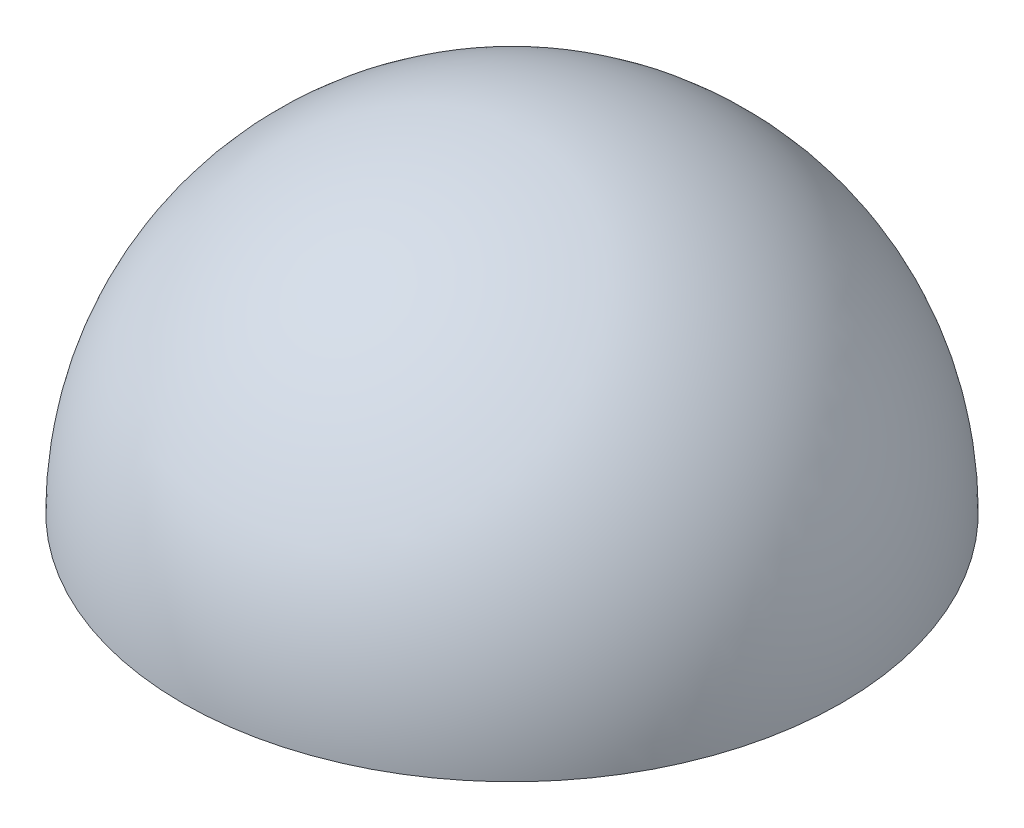
ISO-10303-21;
HEADER;
FILE_DESCRIPTION(('STEP AP214'),'2;1');
FILE_NAME('part.step','',(''),(''),'','','');
FILE_SCHEMA(('AUTOMOTIVE_DESIGN { 1 0 10303 214 1 1 1 1 }'));
ENDSEC;
DATA;
#1=APPLICATION_CONTEXT('core data for automotive mechanical design processes');
#2=APPLICATION_PROTOCOL_DEFINITION('international standard','automotive_design',2000,#1);
#3=PRODUCT_CONTEXT('',#1,'mechanical');
#4=PRODUCT('Part','Part','',(#3));
#5=PRODUCT_RELATED_PRODUCT_CATEGORY('part','',(#4));
#6=PRODUCT_DEFINITION_FORMATION('','',#4);
#7=PRODUCT_DEFINITION_CONTEXT('part definition',#1,'design');
#8=PRODUCT_DEFINITION('design','',#6,#7);
#9=PRODUCT_DEFINITION_SHAPE('','',#8);
#10=(LENGTH_UNIT() NAMED_UNIT(*) SI_UNIT(.MILLI.,.METRE.));
#11=(NAMED_UNIT(*) PLANE_ANGLE_UNIT() SI_UNIT($,.RADIAN.));
#12=(NAMED_UNIT(*) SI_UNIT($,.STERADIAN.) SOLID_ANGLE_UNIT());
#13=UNCERTAINTY_MEASURE_WITH_UNIT(LENGTH_MEASURE(1.E-05),#10,'distance_accuracy_value','');
#14=(GEOMETRIC_REPRESENTATION_CONTEXT(3) GLOBAL_UNCERTAINTY_ASSIGNED_CONTEXT((#13)) GLOBAL_UNIT_ASSIGNED_CONTEXT((#10,
#11,#12)) REPRESENTATION_CONTEXT('',''));
#15=CARTESIAN_POINT('',(0.,0.,0.));
#16=DIRECTION('',(0.,0.,1.));
#17=DIRECTION('',(1.,0.,0.));
#18=AXIS2_PLACEMENT_3D('',#15,#16,#17);
#19=CARTESIAN_POINT('',(0.,0.,0.));
#20=DIRECTION('',(0.,-1.,0.));
#21=DIRECTION('',(0.,0.,-1.));
#22=AXIS2_PLACEMENT_3D('',#19,#20,#21);
#23=PLANE('',#22);
#24=CARTESIAN_POINT('',(0.,0.,0.));
#25=DIRECTION('',(0.,-1.,0.));
#26=DIRECTION('',(0.,0.,-1.));
#27=AXIS2_PLACEMENT_3D('',#24,#25,#26);
#28=CIRCLE('',#27,160.);
#29=CARTESIAN_POINT('',(0.,0.,-160.));
#30=VERTEX_POINT('',#29);
#31=EDGE_CURVE('E10',#30,#30,#28,.T.);
#32=ORIENTED_EDGE('',*,*,#31,.T.);
#33=EDGE_LOOP('',(#32));
#34=FACE_BOUND('',#33,.T.);
#35=ADVANCED_FACE('F43',(#34),#23,.T.);
#36=CARTESIAN_POINT('',(0.,0.,0.));
#37=DIRECTION('',(0.,-1.,0.));
#38=DIRECTION('',(1.,0.,0.));
#39=AXIS2_PLACEMENT_3D('',#36,#37,#38);
#40=SPHERICAL_SURFACE('',#39,160.);
#41=ORIENTED_EDGE('',*,*,#31,.F.);
#42=EDGE_LOOP('',(#41));
#43=FACE_BOUND('',#42,.T.);
#44=ADVANCED_FACE('F51',(#43),#40,.T.);
#45=CLOSED_SHELL('',(#35,#44));
#46=MANIFOLD_SOLID_BREP('B2',#45);
#47=ADVANCED_BREP_SHAPE_REPRESENTATION('',(#18,#46),#14);
#48=SHAPE_DEFINITION_REPRESENTATION(#9,#47);
ENDSEC;
END-ISO-10303-21;
